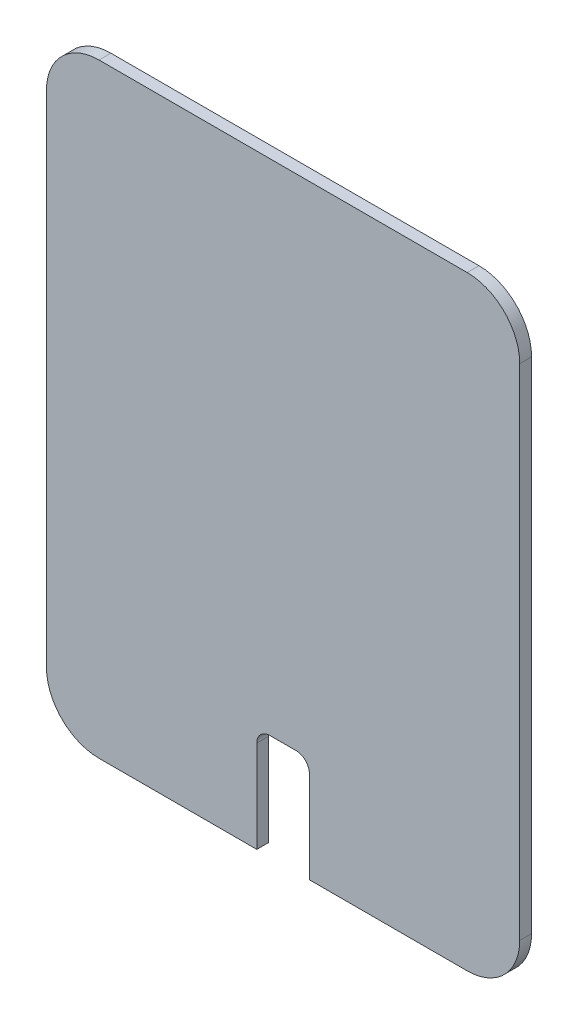
ISO-10303-21;
HEADER;
FILE_DESCRIPTION(('STEP AP214'),'2;1');
FILE_NAME('part.step','',(''),(''),'','','');
FILE_SCHEMA(('AUTOMOTIVE_DESIGN { 1 0 10303 214 1 1 1 1 }'));
ENDSEC;
DATA;
#1=APPLICATION_CONTEXT('core data for automotive mechanical design processes');
#2=APPLICATION_PROTOCOL_DEFINITION('international standard','automotive_design',2000,#1);
#3=PRODUCT_CONTEXT('',#1,'mechanical');
#4=PRODUCT('Part','Part','',(#3));
#5=PRODUCT_RELATED_PRODUCT_CATEGORY('part','',(#4));
#6=PRODUCT_DEFINITION_FORMATION('','',#4);
#7=PRODUCT_DEFINITION_CONTEXT('part definition',#1,'design');
#8=PRODUCT_DEFINITION('design','',#6,#7);
#9=PRODUCT_DEFINITION_SHAPE('','',#8);
#10=(LENGTH_UNIT() NAMED_UNIT(*) SI_UNIT(.MILLI.,.METRE.));
#11=(NAMED_UNIT(*) PLANE_ANGLE_UNIT() SI_UNIT($,.RADIAN.));
#12=(NAMED_UNIT(*) SI_UNIT($,.STERADIAN.) SOLID_ANGLE_UNIT());
#13=UNCERTAINTY_MEASURE_WITH_UNIT(LENGTH_MEASURE(1.E-05),#10,'distance_accuracy_value','');
#14=(GEOMETRIC_REPRESENTATION_CONTEXT(3) GLOBAL_UNCERTAINTY_ASSIGNED_CONTEXT((#13)) GLOBAL_UNIT_ASSIGNED_CONTEXT((#10,
#11,#12)) REPRESENTATION_CONTEXT('',''));
#15=CARTESIAN_POINT('',(0.,0.,0.));
#16=DIRECTION('',(0.,0.,1.));
#17=DIRECTION('',(1.,0.,0.));
#18=AXIS2_PLACEMENT_3D('',#15,#16,#17);
#19=CARTESIAN_POINT('',(-69.9999999999999,-115.,4.5));
#20=DIRECTION('',(0.,1.,0.));
#21=DIRECTION('',(0.,0.,1.));
#22=AXIS2_PLACEMENT_3D('',#19,#20,#21);
#23=PLANE('',#22);
#24=DIRECTION('',(1.,0.,0.));
#25=VECTOR('',#24,1.);
#26=CARTESIAN_POINT('',(-69.9999999999999,-115.,0.));
#27=LINE('',#26,#25);
#28=CARTESIAN_POINT('',(-69.9999999999999,-115.,0.));
#29=VERTEX_POINT('',#28);
#30=CARTESIAN_POINT('',(-9.99999999999999,-115.,0.));
#31=VERTEX_POINT('',#30);
#32=EDGE_CURVE('E150',#29,#31,#27,.T.);
#33=ORIENTED_EDGE('',*,*,#32,.T.);
#34=DIRECTION('',(0.,0.,1.));
#35=VECTOR('',#34,1.);
#36=CARTESIAN_POINT('',(-9.99999999999999,-115.,4.5));
#37=LINE('',#36,#35);
#38=CARTESIAN_POINT('',(-9.99999999999999,-115.,4.5));
#39=VERTEX_POINT('',#38);
#40=EDGE_CURVE('E149',#31,#39,#37,.T.);
#41=ORIENTED_EDGE('',*,*,#40,.T.);
#42=DIRECTION('',(1.,0.,0.));
#43=VECTOR('',#42,1.);
#44=CARTESIAN_POINT('',(-69.9999999999999,-115.,4.5));
#45=LINE('',#44,#43);
#46=CARTESIAN_POINT('',(-69.9999999999999,-115.,4.5));
#47=VERTEX_POINT('',#46);
#48=EDGE_CURVE('E101',#47,#39,#45,.T.);
#49=ORIENTED_EDGE('',*,*,#48,.F.);
#50=DIRECTION('',(0.,0.,-1.));
#51=VECTOR('',#50,1.);
#52=CARTESIAN_POINT('',(-69.9999999999999,-115.,4.5));
#53=LINE('',#52,#51);
#54=EDGE_CURVE('E43',#47,#29,#53,.T.);
#55=ORIENTED_EDGE('',*,*,#54,.T.);
#56=EDGE_LOOP('',(#33,#41,#49,#55));
#57=FACE_BOUND('',#56,.T.);
#58=ADVANCED_FACE('F35',(#57),#23,.F.);
#59=CARTESIAN_POINT('',(-70.,-95.,4.5));
#60=DIRECTION('',(0.,0.,-1.));
#61=DIRECTION('',(-1.,0.,0.));
#62=AXIS2_PLACEMENT_3D('',#59,#60,#61);
#63=CYLINDRICAL_SURFACE('',#62,20.);
#64=CARTESIAN_POINT('',(-70.,-95.,0.));
#65=DIRECTION('',(0.,0.,1.));
#66=DIRECTION('',(-1.,0.,0.));
#67=AXIS2_PLACEMENT_3D('',#64,#65,#66);
#68=CIRCLE('',#67,20.);
#69=CARTESIAN_POINT('',(-90.,-94.9999999999999,0.));
#70=VERTEX_POINT('',#69);
#71=EDGE_CURVE('E145',#70,#29,#68,.T.);
#72=ORIENTED_EDGE('',*,*,#71,.T.);
#73=ORIENTED_EDGE('',*,*,#54,.F.);
#74=CARTESIAN_POINT('',(-70.,-95.,4.5));
#75=DIRECTION('',(0.,0.,1.));
#76=DIRECTION('',(-1.,0.,0.));
#77=AXIS2_PLACEMENT_3D('',#74,#75,#76);
#78=CIRCLE('',#77,20.);
#79=CARTESIAN_POINT('',(-90.,-94.9999999999999,4.5));
#80=VERTEX_POINT('',#79);
#81=EDGE_CURVE('E163',#80,#47,#78,.T.);
#82=ORIENTED_EDGE('',*,*,#81,.F.);
#83=DIRECTION('',(0.,0.,-1.));
#84=VECTOR('',#83,1.);
#85=CARTESIAN_POINT('',(-90.,-94.9999999999999,4.5));
#86=LINE('',#85,#84);
#87=EDGE_CURVE('E141',#80,#70,#86,.T.);
#88=ORIENTED_EDGE('',*,*,#87,.T.);
#89=EDGE_LOOP('',(#72,#73,#82,#88));
#90=FACE_BOUND('',#89,.T.);
#91=ADVANCED_FACE('F37',(#90),#63,.T.);
#92=CARTESIAN_POINT('',(10.,-115.,4.5));
#93=VERTEX_POINT('',#92);
#94=CARTESIAN_POINT('',(69.9999999999999,-115.,4.5));
#95=VERTEX_POINT('',#94);
#96=EDGE_CURVE('E229',#93,#95,#45,.T.);
#97=ORIENTED_EDGE('',*,*,#96,.F.);
#98=DIRECTION('',(0.,0.,-1.));
#99=VECTOR('',#98,1.);
#100=CARTESIAN_POINT('',(10.,-115.,4.5));
#101=LINE('',#100,#99);
#102=CARTESIAN_POINT('',(10.,-115.,0.));
#103=VERTEX_POINT('',#102);
#104=EDGE_CURVE('E217',#93,#103,#101,.T.);
#105=ORIENTED_EDGE('',*,*,#104,.T.);
#106=CARTESIAN_POINT('',(69.9999999999999,-115.,0.));
#107=VERTEX_POINT('',#106);
#108=EDGE_CURVE('E148',#103,#107,#27,.T.);
#109=ORIENTED_EDGE('',*,*,#108,.T.);
#110=DIRECTION('',(0.,0.,-1.));
#111=VECTOR('',#110,1.);
#112=CARTESIAN_POINT('',(69.9999999999999,-115.,4.5));
#113=LINE('',#112,#111);
#114=EDGE_CURVE('E173',#95,#107,#113,.T.);
#115=ORIENTED_EDGE('',*,*,#114,.F.);
#116=EDGE_LOOP('',(#97,#105,#109,#115));
#117=FACE_BOUND('',#116,.T.);
#118=ADVANCED_FACE('F281',(#117),#23,.F.);
#119=CARTESIAN_POINT('',(70.,-95.,4.5));
#120=DIRECTION('',(0.,0.,-1.));
#121=DIRECTION('',(-1.,0.,0.));
#122=AXIS2_PLACEMENT_3D('',#119,#120,#121);
#123=CYLINDRICAL_SURFACE('',#122,20.);
#124=CARTESIAN_POINT('',(70.,-95.,0.));
#125=DIRECTION('',(0.,0.,1.));
#126=DIRECTION('',(1.,0.,0.));
#127=AXIS2_PLACEMENT_3D('',#124,#125,#126);
#128=CIRCLE('',#127,20.);
#129=CARTESIAN_POINT('',(90.,-95.,0.));
#130=VERTEX_POINT('',#129);
#131=EDGE_CURVE('E153',#107,#130,#128,.T.);
#132=ORIENTED_EDGE('',*,*,#131,.T.);
#133=DIRECTION('',(0.,0.,-1.));
#134=VECTOR('',#133,1.);
#135=CARTESIAN_POINT('',(90.,-95.,4.5));
#136=LINE('',#135,#134);
#137=CARTESIAN_POINT('',(90.,-95.,4.5));
#138=VERTEX_POINT('',#137);
#139=EDGE_CURVE('E170',#138,#130,#136,.T.);
#140=ORIENTED_EDGE('',*,*,#139,.F.);
#141=CARTESIAN_POINT('',(70.,-95.,4.5));
#142=DIRECTION('',(0.,0.,1.));
#143=DIRECTION('',(1.,0.,0.));
#144=AXIS2_PLACEMENT_3D('',#141,#142,#143);
#145=CIRCLE('',#144,20.);
#146=EDGE_CURVE('E231',#95,#138,#145,.T.);
#147=ORIENTED_EDGE('',*,*,#146,.F.);
#148=ORIENTED_EDGE('',*,*,#114,.T.);
#149=EDGE_LOOP('',(#132,#140,#147,#148));
#150=FACE_BOUND('',#149,.T.);
#151=ADVANCED_FACE('F301',(#150),#123,.T.);
#152=CARTESIAN_POINT('',(90.,-94.9999999999999,4.5));
#153=DIRECTION('',(-1.,0.,0.));
#154=DIRECTION('',(0.,0.,1.));
#155=AXIS2_PLACEMENT_3D('',#152,#153,#154);
#156=PLANE('',#155);
#157=DIRECTION('',(0.,1.,0.));
#158=VECTOR('',#157,1.);
#159=CARTESIAN_POINT('',(90.,-94.9999999999999,0.));
#160=LINE('',#159,#158);
#161=CARTESIAN_POINT('',(90.,94.9999999999999,0.));
#162=VERTEX_POINT('',#161);
#163=EDGE_CURVE('E155',#130,#162,#160,.T.);
#164=ORIENTED_EDGE('',*,*,#163,.T.);
#165=DIRECTION('',(0.,0.,-1.));
#166=VECTOR('',#165,1.);
#167=CARTESIAN_POINT('',(90.,94.9999999999999,4.5));
#168=LINE('',#167,#166);
#169=CARTESIAN_POINT('',(90.,94.9999999999999,4.5));
#170=VERTEX_POINT('',#169);
#171=EDGE_CURVE('E167',#170,#162,#168,.T.);
#172=ORIENTED_EDGE('',*,*,#171,.F.);
#173=DIRECTION('',(0.,1.,0.));
#174=VECTOR('',#173,1.);
#175=CARTESIAN_POINT('',(90.,-94.9999999999999,4.5));
#176=LINE('',#175,#174);
#177=EDGE_CURVE('E233',#138,#170,#176,.T.);
#178=ORIENTED_EDGE('',*,*,#177,.F.);
#179=ORIENTED_EDGE('',*,*,#139,.T.);
#180=EDGE_LOOP('',(#164,#172,#178,#179));
#181=FACE_BOUND('',#180,.T.);
#182=ADVANCED_FACE('F239',(#181),#156,.F.);
#183=CARTESIAN_POINT('',(70.,95.,4.5));
#184=DIRECTION('',(0.,0.,-1.));
#185=DIRECTION('',(-1.,0.,0.));
#186=AXIS2_PLACEMENT_3D('',#183,#184,#185);
#187=CYLINDRICAL_SURFACE('',#186,20.);
#188=CARTESIAN_POINT('',(70.,95.,0.));
#189=DIRECTION('',(0.,0.,1.));
#190=DIRECTION('',(-1.,0.,0.));
#191=AXIS2_PLACEMENT_3D('',#188,#189,#190);
#192=CIRCLE('',#191,20.);
#193=CARTESIAN_POINT('',(69.9999999999999,115.,0.));
#194=VERTEX_POINT('',#193);
#195=EDGE_CURVE('E157',#162,#194,#192,.T.);
#196=ORIENTED_EDGE('',*,*,#195,.T.);
#197=DIRECTION('',(0.,0.,-1.));
#198=VECTOR('',#197,1.);
#199=CARTESIAN_POINT('',(69.9999999999999,115.,4.5));
#200=LINE('',#199,#198);
#201=CARTESIAN_POINT('',(69.9999999999999,115.,4.5));
#202=VERTEX_POINT('',#201);
#203=EDGE_CURVE('E136',#202,#194,#200,.T.);
#204=ORIENTED_EDGE('',*,*,#203,.F.);
#205=CARTESIAN_POINT('',(70.,95.,4.5));
#206=DIRECTION('',(0.,0.,1.));
#207=DIRECTION('',(-1.,0.,0.));
#208=AXIS2_PLACEMENT_3D('',#205,#206,#207);
#209=CIRCLE('',#208,20.);
#210=EDGE_CURVE('E124',#170,#202,#209,.T.);
#211=ORIENTED_EDGE('',*,*,#210,.F.);
#212=ORIENTED_EDGE('',*,*,#171,.T.);
#213=EDGE_LOOP('',(#196,#204,#211,#212));
#214=FACE_BOUND('',#213,.T.);
#215=ADVANCED_FACE('F243',(#214),#187,.T.);
#216=CARTESIAN_POINT('',(-69.9999999999999,115.,4.5));
#217=DIRECTION('',(0.,-1.,0.));
#218=DIRECTION('',(0.,0.,-1.));
#219=AXIS2_PLACEMENT_3D('',#216,#217,#218);
#220=PLANE('',#219);
#221=DIRECTION('',(-1.,0.,0.));
#222=VECTOR('',#221,1.);
#223=CARTESIAN_POINT('',(-69.9999999999999,115.,0.));
#224=LINE('',#223,#222);
#225=CARTESIAN_POINT('',(-69.9999999999999,115.,0.));
#226=VERTEX_POINT('',#225);
#227=EDGE_CURVE('E133',#194,#226,#224,.T.);
#228=ORIENTED_EDGE('',*,*,#227,.T.);
#229=DIRECTION('',(0.,0.,-1.));
#230=VECTOR('',#229,1.);
#231=CARTESIAN_POINT('',(-69.9999999999999,115.,4.5));
#232=LINE('',#231,#230);
#233=CARTESIAN_POINT('',(-69.9999999999999,115.,4.5));
#234=VERTEX_POINT('',#233);
#235=EDGE_CURVE('E130',#234,#226,#232,.T.);
#236=ORIENTED_EDGE('',*,*,#235,.F.);
#237=DIRECTION('',(-1.,0.,0.));
#238=VECTOR('',#237,1.);
#239=CARTESIAN_POINT('',(-69.9999999999999,115.,4.5));
#240=LINE('',#239,#238);
#241=EDGE_CURVE('E117',#202,#234,#240,.T.);
#242=ORIENTED_EDGE('',*,*,#241,.F.);
#243=ORIENTED_EDGE('',*,*,#203,.T.);
#244=EDGE_LOOP('',(#228,#236,#242,#243));
#245=FACE_BOUND('',#244,.T.);
#246=ADVANCED_FACE('F131',(#245),#220,.F.);
#247=CARTESIAN_POINT('',(-70.,95.,4.5));
#248=DIRECTION('',(0.,0.,-1.));
#249=DIRECTION('',(-1.,0.,0.));
#250=AXIS2_PLACEMENT_3D('',#247,#248,#249);
#251=CYLINDRICAL_SURFACE('',#250,20.);
#252=CARTESIAN_POINT('',(-70.,95.,0.));
#253=DIRECTION('',(0.,0.,1.));
#254=DIRECTION('',(-1.,0.,0.));
#255=AXIS2_PLACEMENT_3D('',#252,#253,#254);
#256=CIRCLE('',#255,20.);
#257=CARTESIAN_POINT('',(-90.,94.9999999999999,0.));
#258=VERTEX_POINT('',#257);
#259=EDGE_CURVE('E160',#226,#258,#256,.T.);
#260=ORIENTED_EDGE('',*,*,#259,.T.);
#261=DIRECTION('',(0.,0.,-1.));
#262=VECTOR('',#261,1.);
#263=CARTESIAN_POINT('',(-90.,94.9999999999999,4.5));
#264=LINE('',#263,#262);
#265=CARTESIAN_POINT('',(-90.,94.9999999999999,4.5));
#266=VERTEX_POINT('',#265);
#267=EDGE_CURVE('E137',#266,#258,#264,.T.);
#268=ORIENTED_EDGE('',*,*,#267,.F.);
#269=CARTESIAN_POINT('',(-70.,95.,4.5));
#270=DIRECTION('',(0.,0.,1.));
#271=DIRECTION('',(-1.,0.,0.));
#272=AXIS2_PLACEMENT_3D('',#269,#270,#271);
#273=CIRCLE('',#272,20.);
#274=EDGE_CURVE('E121',#234,#266,#273,.T.);
#275=ORIENTED_EDGE('',*,*,#274,.F.);
#276=ORIENTED_EDGE('',*,*,#235,.T.);
#277=EDGE_LOOP('',(#260,#268,#275,#276));
#278=FACE_BOUND('',#277,.T.);
#279=ADVANCED_FACE('F139',(#278),#251,.T.);
#280=CARTESIAN_POINT('',(-90.,-94.9999999999999,4.5));
#281=DIRECTION('',(1.,0.,0.));
#282=DIRECTION('',(0.,0.,-1.));
#283=AXIS2_PLACEMENT_3D('',#280,#281,#282);
#284=PLANE('',#283);
#285=DIRECTION('',(0.,-1.,0.));
#286=VECTOR('',#285,1.);
#287=CARTESIAN_POINT('',(-90.,-94.9999999999999,0.));
#288=LINE('',#287,#286);
#289=EDGE_CURVE('E92',#258,#70,#288,.T.);
#290=ORIENTED_EDGE('',*,*,#289,.T.);
#291=ORIENTED_EDGE('',*,*,#87,.F.);
#292=DIRECTION('',(0.,-1.,0.));
#293=VECTOR('',#292,1.);
#294=CARTESIAN_POINT('',(-90.,-94.9999999999999,4.5));
#295=LINE('',#294,#293);
#296=EDGE_CURVE('E59',#266,#80,#295,.T.);
#297=ORIENTED_EDGE('',*,*,#296,.F.);
#298=ORIENTED_EDGE('',*,*,#267,.T.);
#299=EDGE_LOOP('',(#290,#291,#297,#298));
#300=FACE_BOUND('',#299,.T.);
#301=ADVANCED_FACE('F244',(#300),#284,.F.);
#302=CARTESIAN_POINT('',(-70.,-95.,4.5));
#303=DIRECTION('',(0.,0.,-1.));
#304=DIRECTION('',(-1.,0.,0.));
#305=AXIS2_PLACEMENT_3D('',#302,#303,#304);
#306=PLANE('',#305);
#307=ORIENTED_EDGE('',*,*,#48,.T.);
#308=DIRECTION('',(0.,-1.,0.));
#309=VECTOR('',#308,1.);
#310=CARTESIAN_POINT('',(-9.99999999999999,-155.,4.5));
#311=LINE('',#310,#309);
#312=CARTESIAN_POINT('',(-10.,-80.0000000000001,4.5));
#313=VERTEX_POINT('',#312);
#314=EDGE_CURVE('E204',#313,#39,#311,.T.);
#315=ORIENTED_EDGE('',*,*,#314,.F.);
#316=CARTESIAN_POINT('',(-5.,-80.,4.5));
#317=DIRECTION('',(0.,0.,1.));
#318=DIRECTION('',(-1.,0.,0.));
#319=AXIS2_PLACEMENT_3D('',#316,#317,#318);
#320=CIRCLE('',#319,5.);
#321=CARTESIAN_POINT('',(-4.99999999999996,-75.,4.5));
#322=VERTEX_POINT('',#321);
#323=EDGE_CURVE('E193',#322,#313,#320,.T.);
#324=ORIENTED_EDGE('',*,*,#323,.F.);
#325=DIRECTION('',(-1.,0.,0.));
#326=VECTOR('',#325,1.);
#327=CARTESIAN_POINT('',(-4.99999999999996,-75.,4.5));
#328=LINE('',#327,#326);
#329=CARTESIAN_POINT('',(4.99999999999997,-75.,4.5));
#330=VERTEX_POINT('',#329);
#331=EDGE_CURVE('E198',#330,#322,#328,.T.);
#332=ORIENTED_EDGE('',*,*,#331,.F.);
#333=CARTESIAN_POINT('',(5.00000000000001,-80.,4.5));
#334=DIRECTION('',(0.,0.,1.));
#335=DIRECTION('',(-1.,0.,0.));
#336=AXIS2_PLACEMENT_3D('',#333,#334,#335);
#337=CIRCLE('',#336,5.);
#338=CARTESIAN_POINT('',(10.,-80.0000000000001,4.5));
#339=VERTEX_POINT('',#338);
#340=EDGE_CURVE('E210',#339,#330,#337,.T.);
#341=ORIENTED_EDGE('',*,*,#340,.F.);
#342=DIRECTION('',(0.,1.,0.));
#343=VECTOR('',#342,1.);
#344=CARTESIAN_POINT('',(10.,-155.,4.5));
#345=LINE('',#344,#343);
#346=EDGE_CURVE('E207',#93,#339,#345,.T.);
#347=ORIENTED_EDGE('',*,*,#346,.F.);
#348=ORIENTED_EDGE('',*,*,#96,.T.);
#349=ORIENTED_EDGE('',*,*,#146,.T.);
#350=ORIENTED_EDGE('',*,*,#177,.T.);
#351=ORIENTED_EDGE('',*,*,#210,.T.);
#352=ORIENTED_EDGE('',*,*,#241,.T.);
#353=ORIENTED_EDGE('',*,*,#274,.T.);
#354=ORIENTED_EDGE('',*,*,#296,.T.);
#355=ORIENTED_EDGE('',*,*,#81,.T.);
#356=EDGE_LOOP('',(#307,#315,#324,#332,#341,#347,#348,#349,#350,#351,#352,#353,#354,#355));
#357=FACE_BOUND('',#356,.T.);
#358=ADVANCED_FACE('F119',(#357),#306,.F.);
#359=CARTESIAN_POINT('',(-70.,-95.,0.));
#360=DIRECTION('',(0.,0.,-1.));
#361=DIRECTION('',(-1.,0.,0.));
#362=AXIS2_PLACEMENT_3D('',#359,#360,#361);
#363=PLANE('',#362);
#364=DIRECTION('',(0.,-1.,0.));
#365=VECTOR('',#364,1.);
#366=CARTESIAN_POINT('',(-9.99999999999999,-155.,0.));
#367=LINE('',#366,#365);
#368=CARTESIAN_POINT('',(-10.,-80.0000000000001,0.));
#369=VERTEX_POINT('',#368);
#370=EDGE_CURVE('E184',#369,#31,#367,.T.);
#371=ORIENTED_EDGE('',*,*,#370,.T.);
#372=ORIENTED_EDGE('',*,*,#32,.F.);
#373=ORIENTED_EDGE('',*,*,#71,.F.);
#374=ORIENTED_EDGE('',*,*,#289,.F.);
#375=ORIENTED_EDGE('',*,*,#259,.F.);
#376=ORIENTED_EDGE('',*,*,#227,.F.);
#377=ORIENTED_EDGE('',*,*,#195,.F.);
#378=ORIENTED_EDGE('',*,*,#163,.F.);
#379=ORIENTED_EDGE('',*,*,#131,.F.);
#380=ORIENTED_EDGE('',*,*,#108,.F.);
#381=DIRECTION('',(0.,-1.,0.));
#382=VECTOR('',#381,1.);
#383=CARTESIAN_POINT('',(10.,-95.,0.));
#384=LINE('',#383,#382);
#385=CARTESIAN_POINT('',(10.,-80.0000000000001,0.));
#386=VERTEX_POINT('',#385);
#387=EDGE_CURVE('E11',#386,#103,#384,.T.);
#388=ORIENTED_EDGE('',*,*,#387,.F.);
#389=CARTESIAN_POINT('',(5.00000000000001,-80.,0.));
#390=DIRECTION('',(0.,0.,1.));
#391=DIRECTION('',(-1.,0.,0.));
#392=AXIS2_PLACEMENT_3D('',#389,#390,#391);
#393=CIRCLE('',#392,5.);
#394=CARTESIAN_POINT('',(4.99999999999997,-75.,0.));
#395=VERTEX_POINT('',#394);
#396=EDGE_CURVE('E50',#386,#395,#393,.T.);
#397=ORIENTED_EDGE('',*,*,#396,.T.);
#398=DIRECTION('',(-1.,0.,0.));
#399=VECTOR('',#398,1.);
#400=CARTESIAN_POINT('',(-4.99999999999996,-75.,0.));
#401=LINE('',#400,#399);
#402=CARTESIAN_POINT('',(-4.99999999999996,-75.,0.));
#403=VERTEX_POINT('',#402);
#404=EDGE_CURVE('E195',#395,#403,#401,.T.);
#405=ORIENTED_EDGE('',*,*,#404,.T.);
#406=CARTESIAN_POINT('',(-5.,-80.,0.));
#407=DIRECTION('',(0.,0.,1.));
#408=DIRECTION('',(-1.,0.,0.));
#409=AXIS2_PLACEMENT_3D('',#406,#407,#408);
#410=CIRCLE('',#409,5.);
#411=EDGE_CURVE('E188',#403,#369,#410,.T.);
#412=ORIENTED_EDGE('',*,*,#411,.T.);
#413=EDGE_LOOP('',(#371,#372,#373,#374,#375,#376,#377,#378,#379,#380,#388,#397,#405,#412));
#414=FACE_BOUND('',#413,.T.);
#415=ADVANCED_FACE('F181',(#414),#363,.T.);
#416=CARTESIAN_POINT('',(-9.99999999999999,-155.,0.));
#417=DIRECTION('',(-1.,0.,0.));
#418=DIRECTION('',(0.,0.,1.));
#419=AXIS2_PLACEMENT_3D('',#416,#417,#418);
#420=PLANE('',#419);
#421=ORIENTED_EDGE('',*,*,#370,.F.);
#422=DIRECTION('',(0.,0.,1.));
#423=VECTOR('',#422,1.);
#424=CARTESIAN_POINT('',(-10.,-80.0000000000001,0.));
#425=LINE('',#424,#423);
#426=EDGE_CURVE('E215',#369,#313,#425,.T.);
#427=ORIENTED_EDGE('',*,*,#426,.T.);
#428=ORIENTED_EDGE('',*,*,#314,.T.);
#429=ORIENTED_EDGE('',*,*,#40,.F.);
#430=EDGE_LOOP('',(#421,#427,#428,#429));
#431=FACE_BOUND('',#430,.T.);
#432=ADVANCED_FACE('F285',(#431),#420,.F.);
#433=CARTESIAN_POINT('',(10.,-155.,0.));
#434=DIRECTION('',(1.,0.,0.));
#435=DIRECTION('',(0.,0.,-1.));
#436=AXIS2_PLACEMENT_3D('',#433,#434,#435);
#437=PLANE('',#436);
#438=ORIENTED_EDGE('',*,*,#346,.T.);
#439=DIRECTION('',(0.,0.,1.));
#440=VECTOR('',#439,1.);
#441=CARTESIAN_POINT('',(10.,-80.0000000000001,0.));
#442=LINE('',#441,#440);
#443=EDGE_CURVE('E203',#386,#339,#442,.T.);
#444=ORIENTED_EDGE('',*,*,#443,.F.);
#445=ORIENTED_EDGE('',*,*,#387,.T.);
#446=ORIENTED_EDGE('',*,*,#104,.F.);
#447=EDGE_LOOP('',(#438,#444,#445,#446));
#448=FACE_BOUND('',#447,.T.);
#449=ADVANCED_FACE('F277',(#448),#437,.F.);
#450=CARTESIAN_POINT('',(-5.,-80.,0.));
#451=DIRECTION('',(0.,0.,1.));
#452=DIRECTION('',(1.,0.,0.));
#453=AXIS2_PLACEMENT_3D('',#450,#451,#452);
#454=CYLINDRICAL_SURFACE('',#453,5.);
#455=ORIENTED_EDGE('',*,*,#323,.T.);
#456=ORIENTED_EDGE('',*,*,#426,.F.);
#457=ORIENTED_EDGE('',*,*,#411,.F.);
#458=DIRECTION('',(0.,0.,1.));
#459=VECTOR('',#458,1.);
#460=CARTESIAN_POINT('',(-4.99999999999996,-75.,0.));
#461=LINE('',#460,#459);
#462=EDGE_CURVE('E218',#403,#322,#461,.T.);
#463=ORIENTED_EDGE('',*,*,#462,.T.);
#464=EDGE_LOOP('',(#455,#456,#457,#463));
#465=FACE_BOUND('',#464,.T.);
#466=ADVANCED_FACE('F284',(#465),#454,.F.);
#467=CARTESIAN_POINT('',(-4.99999999999996,-75.,0.));
#468=DIRECTION('',(0.,1.,0.));
#469=DIRECTION('',(0.,0.,1.));
#470=AXIS2_PLACEMENT_3D('',#467,#468,#469);
#471=PLANE('',#470);
#472=ORIENTED_EDGE('',*,*,#331,.T.);
#473=ORIENTED_EDGE('',*,*,#462,.F.);
#474=ORIENTED_EDGE('',*,*,#404,.F.);
#475=DIRECTION('',(0.,0.,1.));
#476=VECTOR('',#475,1.);
#477=CARTESIAN_POINT('',(4.99999999999997,-75.,0.));
#478=LINE('',#477,#476);
#479=EDGE_CURVE('E221',#395,#330,#478,.T.);
#480=ORIENTED_EDGE('',*,*,#479,.T.);
#481=EDGE_LOOP('',(#472,#473,#474,#480));
#482=FACE_BOUND('',#481,.T.);
#483=ADVANCED_FACE('F272',(#482),#471,.F.);
#484=CARTESIAN_POINT('',(5.00000000000001,-80.,0.));
#485=DIRECTION('',(0.,0.,1.));
#486=DIRECTION('',(1.,0.,0.));
#487=AXIS2_PLACEMENT_3D('',#484,#485,#486);
#488=CYLINDRICAL_SURFACE('',#487,5.);
#489=ORIENTED_EDGE('',*,*,#340,.T.);
#490=ORIENTED_EDGE('',*,*,#479,.F.);
#491=ORIENTED_EDGE('',*,*,#396,.F.);
#492=ORIENTED_EDGE('',*,*,#443,.T.);
#493=EDGE_LOOP('',(#489,#490,#491,#492));
#494=FACE_BOUND('',#493,.T.);
#495=ADVANCED_FACE('F268',(#494),#488,.F.);
#496=CLOSED_SHELL('',(#58,#91,#118,#151,#182,#215,#246,#279,#301,#358,#415,#432,#449,#466,#483,#495));
#497=MANIFOLD_SOLID_BREP('B2',#496);
#498=ADVANCED_BREP_SHAPE_REPRESENTATION('',(#18,#497),#14);
#499=SHAPE_DEFINITION_REPRESENTATION(#9,#498);
ENDSEC;
END-ISO-10303-21;
